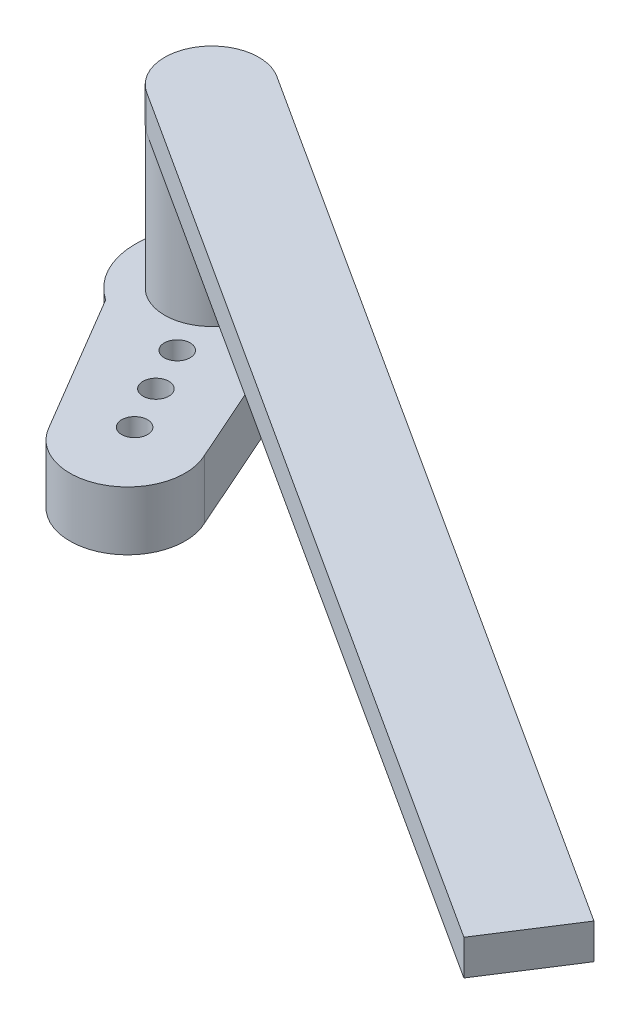
ISO-10303-21;
HEADER;
FILE_DESCRIPTION(('STEP AP214'),'2;1');
FILE_NAME('part.step','',(''),(''),'','','');
FILE_SCHEMA(('AUTOMOTIVE_DESIGN { 1 0 10303 214 1 1 1 1 }'));
ENDSEC;
DATA;
#1=APPLICATION_CONTEXT('core data for automotive mechanical design processes');
#2=APPLICATION_PROTOCOL_DEFINITION('international standard','automotive_design',2000,#1);
#3=PRODUCT_CONTEXT('',#1,'mechanical');
#4=PRODUCT('Part','Part','',(#3));
#5=PRODUCT_RELATED_PRODUCT_CATEGORY('part','',(#4));
#6=PRODUCT_DEFINITION_FORMATION('','',#4);
#7=PRODUCT_DEFINITION_CONTEXT('part definition',#1,'design');
#8=PRODUCT_DEFINITION('design','',#6,#7);
#9=PRODUCT_DEFINITION_SHAPE('','',#8);
#10=(LENGTH_UNIT() NAMED_UNIT(*) SI_UNIT(.MILLI.,.METRE.));
#11=(NAMED_UNIT(*) PLANE_ANGLE_UNIT() SI_UNIT($,.RADIAN.));
#12=(NAMED_UNIT(*) SI_UNIT($,.STERADIAN.) SOLID_ANGLE_UNIT());
#13=UNCERTAINTY_MEASURE_WITH_UNIT(LENGTH_MEASURE(1.E-05),#10,'distance_accuracy_value','');
#14=(GEOMETRIC_REPRESENTATION_CONTEXT(3) GLOBAL_UNCERTAINTY_ASSIGNED_CONTEXT((#13)) GLOBAL_UNIT_ASSIGNED_CONTEXT((#10,
#11,#12)) REPRESENTATION_CONTEXT('',''));
#15=CARTESIAN_POINT('',(0.,0.,0.));
#16=DIRECTION('',(0.,0.,1.));
#17=DIRECTION('',(1.,0.,0.));
#18=AXIS2_PLACEMENT_3D('',#15,#16,#17);
#19=CARTESIAN_POINT('',(-125.332571220291,17.1569540318954,55.4392405632121));
#20=DIRECTION('',(-0.914525403335498,0.,0.404528474466316));
#21=DIRECTION('',(0.404528474466316,0.,0.914525403335498));
#22=AXIS2_PLACEMENT_3D('',#19,#20,#21);
#23=PLANE('',#22);
#24=DIRECTION('',(0.,-1.,0.));
#25=VECTOR('',#24,1.);
#26=CARTESIAN_POINT('',(-47.2251953152146,17.1569540318953,232.018106976274));
#27=LINE('',#26,#25);
#28=CARTESIAN_POINT('',(-47.2251953152146,17.1569540318953,232.018106976274));
#29=VERTEX_POINT('',#28);
#30=CARTESIAN_POINT('',(-47.2251953152146,12.1569540318953,232.018106976274));
#31=VERTEX_POINT('',#30);
#32=EDGE_CURVE('E242',#29,#31,#27,.T.);
#33=ORIENTED_EDGE('',*,*,#32,.T.);
#34=DIRECTION('',(0.404528474466315,0.,0.914525403335498));
#35=VECTOR('',#34,1.);
#36=CARTESIAN_POINT('',(-52.7290342603221,12.1569540318953,219.575471046113));
#37=LINE('',#36,#35);
#38=CARTESIAN_POINT('',(-52.7290342603221,12.1569540318953,219.575471046113));
#39=VERTEX_POINT('',#38);
#40=EDGE_CURVE('E213',#39,#31,#37,.T.);
#41=ORIENTED_EDGE('',*,*,#40,.F.);
#42=DIRECTION('',(0.,-1.,0.));
#43=VECTOR('',#42,1.);
#44=CARTESIAN_POINT('',(-52.7290342603221,17.1569540318953,219.575471046113));
#45=LINE('',#44,#43);
#46=CARTESIAN_POINT('',(-52.7290342603221,17.1569540318953,219.575471046113));
#47=VERTEX_POINT('',#46);
#48=EDGE_CURVE('E12',#47,#39,#45,.T.);
#49=ORIENTED_EDGE('',*,*,#48,.F.);
#50=DIRECTION('',(-0.404528474466316,0.,-0.914525403335498));
#51=VECTOR('',#50,1.);
#52=CARTESIAN_POINT('',(-125.332571220291,17.1569540318954,55.4392405632121));
#53=LINE('',#52,#51);
#54=EDGE_CURVE('E223',#29,#47,#53,.T.);
#55=ORIENTED_EDGE('',*,*,#54,.F.);
#56=EDGE_LOOP('',(#33,#41,#49,#55));
#57=FACE_BOUND('',#56,.T.);
#58=ADVANCED_FACE('F54',(#57),#23,.F.);
#59=CARTESIAN_POINT('',(-59.2267432720247,17.1569540318953,219.402909175357));
#60=DIRECTION('',(0.,-1.,0.));
#61=DIRECTION('',(0.,0.,-1.));
#62=AXIS2_PLACEMENT_3D('',#59,#60,#61);
#63=CYLINDRICAL_SURFACE('',#62,6.5);
#64=ORIENTED_EDGE('',*,*,#48,.T.);
#65=CARTESIAN_POINT('',(-59.2267432720247,12.1569540318953,219.402909175357));
#66=DIRECTION('',(0.,-1.,0.));
#67=DIRECTION('',(0.,0.,-1.));
#68=AXIS2_PLACEMENT_3D('',#65,#66,#67);
#69=CIRCLE('',#68,6.50000000000002);
#70=CARTESIAN_POINT('',(-62.8629678024925,12.1569540318953,224.790661133644));
#71=VERTEX_POINT('',#70);
#72=EDGE_CURVE('E210',#71,#39,#69,.T.);
#73=ORIENTED_EDGE('',*,*,#72,.F.);
#74=DIRECTION('',(0.,-1.,0.));
#75=VECTOR('',#74,1.);
#76=CARTESIAN_POINT('',(-62.8629678024925,17.1569540318953,224.790661133644));
#77=LINE('',#76,#75);
#78=CARTESIAN_POINT('',(-62.8629678024925,17.1569540318953,224.790661133644));
#79=VERTEX_POINT('',#78);
#80=EDGE_CURVE('E61',#79,#71,#77,.T.);
#81=ORIENTED_EDGE('',*,*,#80,.F.);
#82=CARTESIAN_POINT('',(-59.2267432720247,17.1569540318953,219.402909175357));
#83=DIRECTION('',(0.,1.,0.));
#84=DIRECTION('',(0.,0.,1.));
#85=AXIS2_PLACEMENT_3D('',#82,#83,#84);
#86=CIRCLE('',#85,6.5);
#87=EDGE_CURVE('E226',#47,#79,#86,.T.);
#88=ORIENTED_EDGE('',*,*,#87,.F.);
#89=EDGE_LOOP('',(#64,#73,#81,#88));
#90=FACE_BOUND('',#89,.T.);
#91=ADVANCED_FACE('F267',(#90),#63,.T.);
#92=CARTESIAN_POINT('',(-145.067901103589,17.1569540318954,85.7980901296145));
#93=DIRECTION('',(0.860728579626344,0.,-0.509064153338669));
#94=DIRECTION('',(-0.509064153338669,0.,-0.860728579626344));
#95=AXIS2_PLACEMENT_3D('',#92,#93,#94);
#96=PLANE('',#95);
#97=ORIENTED_EDGE('',*,*,#80,.T.);
#98=DIRECTION('',(-0.509064153338669,0.,-0.860728579626344));
#99=VECTOR('',#98,1.);
#100=CARTESIAN_POINT('',(-55.9368617566929,12.1569540318952,236.501360816668));
#101=LINE('',#100,#99);
#102=CARTESIAN_POINT('',(-55.9368617566929,12.1569540318952,236.501360816668));
#103=VERTEX_POINT('',#102);
#104=EDGE_CURVE('E219',#103,#71,#101,.T.);
#105=ORIENTED_EDGE('',*,*,#104,.F.);
#106=DIRECTION('',(0.,-1.,0.));
#107=VECTOR('',#106,1.);
#108=CARTESIAN_POINT('',(-55.9368617566929,17.1569540318952,236.501360816668));
#109=LINE('',#108,#107);
#110=CARTESIAN_POINT('',(-55.9368617566929,17.1569540318952,236.501360816668));
#111=VERTEX_POINT('',#110);
#112=EDGE_CURVE('E254',#111,#103,#109,.T.);
#113=ORIENTED_EDGE('',*,*,#112,.F.);
#114=DIRECTION('',(0.509064153338669,0.,0.860728579626344));
#115=VECTOR('',#114,1.);
#116=CARTESIAN_POINT('',(-145.067901103589,17.1569540318954,85.7980901296145));
#117=LINE('',#116,#115);
#118=EDGE_CURVE('E229',#79,#111,#117,.T.);
#119=ORIENTED_EDGE('',*,*,#118,.F.);
#120=EDGE_LOOP('',(#97,#105,#113,#119));
#121=FACE_BOUND('',#120,.T.);
#122=ADVANCED_FACE('F259',(#121),#96,.F.);
#123=CARTESIAN_POINT('',(-56.1151477013877,17.1569540318953,225.44922813856));
#124=DIRECTION('',(0.,-1.,0.));
#125=DIRECTION('',(0.,0.,-1.));
#126=AXIS2_PLACEMENT_3D('',#123,#124,#125);
#127=CYLINDRICAL_SURFACE('',#126,1.1);
#128=CARTESIAN_POINT('',(-56.1151477013877,17.1569540318953,225.44922813856));
#129=DIRECTION('',(0.,1.,0.));
#130=DIRECTION('',(0.,0.,1.));
#131=AXIS2_PLACEMENT_3D('',#128,#129,#130);
#132=CIRCLE('',#131,1.1);
#133=CARTESIAN_POINT('',(-56.1151477013877,17.1569540318953,226.54922813856));
#134=VERTEX_POINT('',#133);
#135=EDGE_CURVE('E239',#134,#134,#132,.T.);
#136=ORIENTED_EDGE('',*,*,#135,.T.);
#137=EDGE_LOOP('',(#136));
#138=FACE_BOUND('',#137,.T.);
#139=CARTESIAN_POINT('',(-56.1151477013877,14.1569540318953,225.44922813856));
#140=DIRECTION('',(0.,1.,0.));
#141=DIRECTION('',(0.,0.,1.));
#142=AXIS2_PLACEMENT_3D('',#139,#140,#141);
#143=CIRCLE('',#142,1.1);
#144=CARTESIAN_POINT('',(-56.1151477013877,14.1569540318953,226.54922813856));
#145=VERTEX_POINT('',#144);
#146=EDGE_CURVE('E248',#145,#145,#143,.T.);
#147=ORIENTED_EDGE('',*,*,#146,.F.);
#148=EDGE_LOOP('',(#147));
#149=FACE_BOUND('',#148,.T.);
#150=ADVANCED_FACE('F290',(#138,#149),#127,.F.);
#151=CARTESIAN_POINT('',(-54.1932798489355,17.1569540318953,229.183719262891));
#152=DIRECTION('',(0.,-1.,0.));
#153=DIRECTION('',(0.,0.,-1.));
#154=AXIS2_PLACEMENT_3D('',#151,#152,#153);
#155=CYLINDRICAL_SURFACE('',#154,1.1);
#156=CARTESIAN_POINT('',(-54.1932798489355,17.1569540318953,229.183719262891));
#157=DIRECTION('',(0.,1.,0.));
#158=DIRECTION('',(0.,0.,1.));
#159=AXIS2_PLACEMENT_3D('',#156,#157,#158);
#160=CIRCLE('',#159,1.1);
#161=CARTESIAN_POINT('',(-54.1932798489355,17.1569540318953,230.283719262891));
#162=VERTEX_POINT('',#161);
#163=EDGE_CURVE('E236',#162,#162,#160,.T.);
#164=ORIENTED_EDGE('',*,*,#163,.T.);
#165=EDGE_LOOP('',(#164));
#166=FACE_BOUND('',#165,.T.);
#167=CARTESIAN_POINT('',(-54.1932798489355,14.1569540318953,229.183719262891));
#168=DIRECTION('',(0.,1.,0.));
#169=DIRECTION('',(0.,0.,1.));
#170=AXIS2_PLACEMENT_3D('',#167,#168,#169);
#171=CIRCLE('',#170,1.1);
#172=CARTESIAN_POINT('',(-54.1932798489355,14.1569540318953,230.283719262891));
#173=VERTEX_POINT('',#172);
#174=EDGE_CURVE('E245',#173,#173,#171,.T.);
#175=ORIENTED_EDGE('',*,*,#174,.F.);
#176=EDGE_LOOP('',(#175));
#177=FACE_BOUND('',#176,.T.);
#178=ADVANCED_FACE('F293',(#166,#177),#155,.F.);
#179=CARTESIAN_POINT('',(-52.2714119964832,17.1569540318953,232.918210387223));
#180=DIRECTION('',(0.,-1.,0.));
#181=DIRECTION('',(0.,0.,-1.));
#182=AXIS2_PLACEMENT_3D('',#179,#180,#181);
#183=CYLINDRICAL_SURFACE('',#182,1.1);
#184=CARTESIAN_POINT('',(-52.2714119964832,17.1569540318953,232.918210387223));
#185=DIRECTION('',(0.,1.,0.));
#186=DIRECTION('',(0.,0.,1.));
#187=AXIS2_PLACEMENT_3D('',#184,#185,#186);
#188=CIRCLE('',#187,1.1);
#189=CARTESIAN_POINT('',(-52.2714119964832,17.1569540318953,234.018210387223));
#190=VERTEX_POINT('',#189);
#191=EDGE_CURVE('E233',#190,#190,#188,.T.);
#192=ORIENTED_EDGE('',*,*,#191,.T.);
#193=EDGE_LOOP('',(#192));
#194=FACE_BOUND('',#193,.T.);
#195=CARTESIAN_POINT('',(-52.2714119964832,14.1569540318953,232.918210387223));
#196=DIRECTION('',(0.,1.,0.));
#197=DIRECTION('',(0.,0.,1.));
#198=AXIS2_PLACEMENT_3D('',#195,#196,#197);
#199=CIRCLE('',#198,1.1);
#200=CARTESIAN_POINT('',(-52.2714119964832,14.1569540318952,234.018210387223));
#201=VERTEX_POINT('',#200);
#202=EDGE_CURVE('E222',#201,#201,#199,.T.);
#203=ORIENTED_EDGE('',*,*,#202,.F.);
#204=EDGE_LOOP('',(#203));
#205=FACE_BOUND('',#204,.T.);
#206=ADVANCED_FACE('F309',(#194,#205),#183,.F.);
#207=CARTESIAN_POINT('',(-51.6307893789992,17.1569540318952,234.163040762));
#208=DIRECTION('',(0.,-1.,0.));
#209=DIRECTION('',(0.,0.,-1.));
#210=AXIS2_PLACEMENT_3D('',#207,#208,#209);
#211=CYLINDRICAL_SURFACE('',#210,4.90000000000015);
#212=ORIENTED_EDGE('',*,*,#112,.T.);
#213=CARTESIAN_POINT('',(-51.6307893789992,12.1569540318952,234.163040762));
#214=DIRECTION('',(0.,-1.,0.));
#215=DIRECTION('',(0.,0.,-1.));
#216=AXIS2_PLACEMENT_3D('',#213,#214,#215);
#217=CIRCLE('',#216,4.90000000000016);
#218=EDGE_CURVE('E216',#31,#103,#217,.T.);
#219=ORIENTED_EDGE('',*,*,#218,.F.);
#220=ORIENTED_EDGE('',*,*,#32,.F.);
#221=CARTESIAN_POINT('',(-51.6307893789992,17.1569540318952,234.163040762));
#222=DIRECTION('',(0.,1.,0.));
#223=DIRECTION('',(0.,0.,1.));
#224=AXIS2_PLACEMENT_3D('',#221,#222,#223);
#225=CIRCLE('',#224,4.90000000000015);
#226=EDGE_CURVE('E231',#111,#29,#225,.T.);
#227=ORIENTED_EDGE('',*,*,#226,.F.);
#228=EDGE_LOOP('',(#212,#219,#220,#227));
#229=FACE_BOUND('',#228,.T.);
#230=ADVANCED_FACE('F274',(#229),#211,.T.);
#231=CARTESIAN_POINT('',(-59.2267432720247,17.1569540318953,219.402909175357));
#232=DIRECTION('',(0.,-1.,0.));
#233=DIRECTION('',(0.,0.,-1.));
#234=AXIS2_PLACEMENT_3D('',#231,#232,#233);
#235=CYLINDRICAL_SURFACE('',#234,1.74999999999999);
#236=CARTESIAN_POINT('',(-59.2267432720247,17.1569540318953,219.402909175357));
#237=DIRECTION('',(0.,1.,0.));
#238=DIRECTION('',(0.,0.,1.));
#239=AXIS2_PLACEMENT_3D('',#236,#237,#238);
#240=CIRCLE('',#239,1.74999999999999);
#241=CARTESIAN_POINT('',(-59.2267432720247,17.1569540318953,221.152909175357));
#242=VERTEX_POINT('',#241);
#243=EDGE_CURVE('E176',#242,#242,#240,.T.);
#244=ORIENTED_EDGE('',*,*,#243,.T.);
#245=EDGE_LOOP('',(#244));
#246=FACE_BOUND('',#245,.T.);
#247=CARTESIAN_POINT('',(-59.2267432720247,14.1569540318953,219.402909175357));
#248=DIRECTION('',(0.,1.,0.));
#249=DIRECTION('',(0.,0.,1.));
#250=AXIS2_PLACEMENT_3D('',#247,#248,#249);
#251=CIRCLE('',#250,1.74999999999999);
#252=CARTESIAN_POINT('',(-59.2267432720247,14.1569540318953,221.152909175357));
#253=VERTEX_POINT('',#252);
#254=EDGE_CURVE('E227',#253,#253,#251,.T.);
#255=ORIENTED_EDGE('',*,*,#254,.F.);
#256=EDGE_LOOP('',(#255));
#257=FACE_BOUND('',#256,.T.);
#258=ADVANCED_FACE('F281',(#246,#257),#235,.F.);
#259=CARTESIAN_POINT('',(0.,17.1569540318955,0.));
#260=DIRECTION('',(0.,1.,0.));
#261=DIRECTION('',(0.,0.,1.));
#262=AXIS2_PLACEMENT_3D('',#259,#260,#261);
#263=PLANE('',#262);
#264=CARTESIAN_POINT('',(-59.2267432720247,17.1569540318953,219.402909175357));
#265=DIRECTION('',(0.,1.,0.));
#266=DIRECTION('',(0.,0.,1.));
#267=AXIS2_PLACEMENT_3D('',#264,#265,#266);
#268=CIRCLE('',#267,4.);
#269=CARTESIAN_POINT('',(-59.2267432720247,17.1569540318953,223.402909175357));
#270=VERTEX_POINT('',#269);
#271=EDGE_CURVE('E174',#270,#270,#268,.T.);
#272=ORIENTED_EDGE('',*,*,#271,.F.);
#273=EDGE_LOOP('',(#272));
#274=FACE_BOUND('',#273,.T.);
#275=ORIENTED_EDGE('',*,*,#54,.T.);
#276=ORIENTED_EDGE('',*,*,#87,.T.);
#277=ORIENTED_EDGE('',*,*,#118,.T.);
#278=ORIENTED_EDGE('',*,*,#226,.T.);
#279=EDGE_LOOP('',(#275,#276,#277,#278));
#280=FACE_BOUND('',#279,.T.);
#281=ORIENTED_EDGE('',*,*,#191,.F.);
#282=EDGE_LOOP('',(#281));
#283=FACE_BOUND('',#282,.T.);
#284=ORIENTED_EDGE('',*,*,#163,.F.);
#285=EDGE_LOOP('',(#284));
#286=FACE_BOUND('',#285,.T.);
#287=ORIENTED_EDGE('',*,*,#135,.F.);
#288=EDGE_LOOP('',(#287));
#289=FACE_BOUND('',#288,.T.);
#290=ADVANCED_FACE('F277',(#274,#280,#283,#286,#289),#263,.T.);
#291=CARTESIAN_POINT('',(0.,14.1569540318955,0.));
#292=DIRECTION('',(0.,1.,0.));
#293=DIRECTION('',(0.,0.,1.));
#294=AXIS2_PLACEMENT_3D('',#291,#292,#293);
#295=PLANE('',#294);
#296=DIRECTION('',(-0.50906415333867,0.,-0.860728579626344));
#297=VECTOR('',#296,1.);
#298=CARTESIAN_POINT('',(-54.1943274219936,14.1569540318952,235.518869918687));
#299=LINE('',#298,#297);
#300=CARTESIAN_POINT('',(-54.1943274219936,14.1569540318952,235.518869918687));
#301=VERTEX_POINT('',#300);
#302=CARTESIAN_POINT('',(-61.3931100666563,14.1569540318953,223.347127084032));
#303=VERTEX_POINT('',#302);
#304=EDGE_CURVE('E185',#301,#303,#299,.T.);
#305=ORIENTED_EDGE('',*,*,#304,.T.);
#306=CARTESIAN_POINT('',(-59.2267432720247,14.1569540318953,219.402909175357));
#307=DIRECTION('',(0.,-1.,0.));
#308=DIRECTION('',(0.,0.,-1.));
#309=AXIS2_PLACEMENT_3D('',#306,#307,#308);
#310=CIRCLE('',#309,4.50000000000001);
#311=CARTESIAN_POINT('',(-54.758018867603,14.1569540318953,219.932533756854));
#312=VERTEX_POINT('',#311);
#313=EDGE_CURVE('E181',#303,#312,#310,.T.);
#314=ORIENTED_EDGE('',*,*,#313,.T.);
#315=DIRECTION('',(0.404528474466316,0.,0.914525403335498));
#316=VECTOR('',#315,1.);
#317=CARTESIAN_POINT('',(-54.758018867603,14.1569540318953,219.932533756854));
#318=LINE('',#317,#316);
#319=CARTESIAN_POINT('',(-49.0374971177129,14.1569540318953,232.865028725248));
#320=VERTEX_POINT('',#319);
#321=EDGE_CURVE('E194',#312,#320,#318,.T.);
#322=ORIENTED_EDGE('',*,*,#321,.T.);
#323=CARTESIAN_POINT('',(-51.6307893789992,14.1569540318952,234.163040762));
#324=DIRECTION('',(0.,-1.,0.));
#325=DIRECTION('',(0.,0.,-1.));
#326=AXIS2_PLACEMENT_3D('',#323,#324,#325);
#327=CIRCLE('',#326,2.90000000000016);
#328=EDGE_CURVE('E197',#320,#301,#327,.T.);
#329=ORIENTED_EDGE('',*,*,#328,.T.);
#330=EDGE_LOOP('',(#305,#314,#322,#329));
#331=FACE_BOUND('',#330,.T.);
#332=ORIENTED_EDGE('',*,*,#202,.T.);
#333=EDGE_LOOP('',(#332));
#334=FACE_BOUND('',#333,.T.);
#335=ORIENTED_EDGE('',*,*,#174,.T.);
#336=EDGE_LOOP('',(#335));
#337=FACE_BOUND('',#336,.T.);
#338=ORIENTED_EDGE('',*,*,#146,.T.);
#339=EDGE_LOOP('',(#338));
#340=FACE_BOUND('',#339,.T.);
#341=ORIENTED_EDGE('',*,*,#254,.T.);
#342=EDGE_LOOP('',(#341));
#343=FACE_BOUND('',#342,.T.);
#344=ADVANCED_FACE('F280',(#331,#334,#337,#340,#343),#295,.F.);
#345=CARTESIAN_POINT('',(-59.2267432720247,12.1569540318953,219.402909175357));
#346=DIRECTION('',(0.,-1.,0.));
#347=DIRECTION('',(0.,0.,-1.));
#348=AXIS2_PLACEMENT_3D('',#345,#346,#347);
#349=PLANE('',#348);
#350=ORIENTED_EDGE('',*,*,#72,.T.);
#351=ORIENTED_EDGE('',*,*,#40,.T.);
#352=ORIENTED_EDGE('',*,*,#218,.T.);
#353=ORIENTED_EDGE('',*,*,#104,.T.);
#354=EDGE_LOOP('',(#350,#351,#352,#353));
#355=FACE_BOUND('',#354,.T.);
#356=DIRECTION('',(0.404528474466316,0.,0.914525403335498));
#357=VECTOR('',#356,1.);
#358=CARTESIAN_POINT('',(-54.758018867603,12.1569540318953,219.932533756854));
#359=LINE('',#358,#357);
#360=CARTESIAN_POINT('',(-54.758018867603,12.1569540318953,219.932533756854));
#361=VERTEX_POINT('',#360);
#362=CARTESIAN_POINT('',(-49.0374971177129,12.1569540318953,232.865028725248));
#363=VERTEX_POINT('',#362);
#364=EDGE_CURVE('E184',#361,#363,#359,.T.);
#365=ORIENTED_EDGE('',*,*,#364,.F.);
#366=CARTESIAN_POINT('',(-59.2267432720247,12.1569540318953,219.402909175357));
#367=DIRECTION('',(0.,-1.,0.));
#368=DIRECTION('',(0.,0.,-1.));
#369=AXIS2_PLACEMENT_3D('',#366,#367,#368);
#370=CIRCLE('',#369,4.50000000000001);
#371=CARTESIAN_POINT('',(-61.3931100666563,12.1569540318953,223.347127084032));
#372=VERTEX_POINT('',#371);
#373=EDGE_CURVE('E182',#372,#361,#370,.T.);
#374=ORIENTED_EDGE('',*,*,#373,.F.);
#375=DIRECTION('',(-0.50906415333867,0.,-0.860728579626344));
#376=VECTOR('',#375,1.);
#377=CARTESIAN_POINT('',(-54.1943274219936,12.1569540318952,235.518869918687));
#378=LINE('',#377,#376);
#379=CARTESIAN_POINT('',(-54.1943274219936,12.1569540318952,235.518869918687));
#380=VERTEX_POINT('',#379);
#381=EDGE_CURVE('E190',#380,#372,#378,.T.);
#382=ORIENTED_EDGE('',*,*,#381,.F.);
#383=CARTESIAN_POINT('',(-51.6307893789992,12.1569540318952,234.163040762));
#384=DIRECTION('',(0.,-1.,0.));
#385=DIRECTION('',(0.,0.,-1.));
#386=AXIS2_PLACEMENT_3D('',#383,#384,#385);
#387=CIRCLE('',#386,2.90000000000016);
#388=EDGE_CURVE('E187',#363,#380,#387,.T.);
#389=ORIENTED_EDGE('',*,*,#388,.F.);
#390=EDGE_LOOP('',(#365,#374,#382,#389));
#391=FACE_BOUND('',#390,.T.);
#392=ADVANCED_FACE('F264',(#355,#391),#349,.T.);
#393=CARTESIAN_POINT('',(-59.2267432720247,12.1569540318953,219.402909175357));
#394=DIRECTION('',(0.,1.,0.));
#395=DIRECTION('',(0.,0.,1.));
#396=AXIS2_PLACEMENT_3D('',#393,#394,#395);
#397=CYLINDRICAL_SURFACE('',#396,4.50000000000001);
#398=ORIENTED_EDGE('',*,*,#313,.F.);
#399=DIRECTION('',(0.,1.,0.));
#400=VECTOR('',#399,1.);
#401=CARTESIAN_POINT('',(-61.3931100666563,12.1569540318953,223.347127084032));
#402=LINE('',#401,#400);
#403=EDGE_CURVE('E76',#372,#303,#402,.T.);
#404=ORIENTED_EDGE('',*,*,#403,.F.);
#405=ORIENTED_EDGE('',*,*,#373,.T.);
#406=DIRECTION('',(0.,1.,0.));
#407=VECTOR('',#406,1.);
#408=CARTESIAN_POINT('',(-54.758018867603,12.1569540318953,219.932533756854));
#409=LINE('',#408,#407);
#410=EDGE_CURVE('E207',#361,#312,#409,.T.);
#411=ORIENTED_EDGE('',*,*,#410,.T.);
#412=EDGE_LOOP('',(#398,#404,#405,#411));
#413=FACE_BOUND('',#412,.T.);
#414=ADVANCED_FACE('F361',(#413),#397,.F.);
#415=CARTESIAN_POINT('',(-54.758018867603,12.1569540318953,219.932533756854));
#416=DIRECTION('',(-0.914525403335498,0.,0.404528474466316));
#417=DIRECTION('',(0.404528474466316,0.,0.914525403335498));
#418=AXIS2_PLACEMENT_3D('',#415,#416,#417);
#419=PLANE('',#418);
#420=ORIENTED_EDGE('',*,*,#321,.F.);
#421=ORIENTED_EDGE('',*,*,#410,.F.);
#422=ORIENTED_EDGE('',*,*,#364,.T.);
#423=DIRECTION('',(0.,1.,0.));
#424=VECTOR('',#423,1.);
#425=CARTESIAN_POINT('',(-49.0374971177129,12.1569540318953,232.865028725248));
#426=LINE('',#425,#424);
#427=EDGE_CURVE('E205',#363,#320,#426,.T.);
#428=ORIENTED_EDGE('',*,*,#427,.T.);
#429=EDGE_LOOP('',(#420,#421,#422,#428));
#430=FACE_BOUND('',#429,.T.);
#431=ADVANCED_FACE('F370',(#430),#419,.T.);
#432=CARTESIAN_POINT('',(-51.6307893789992,12.1569540318952,234.163040762));
#433=DIRECTION('',(0.,1.,0.));
#434=DIRECTION('',(0.,0.,1.));
#435=AXIS2_PLACEMENT_3D('',#432,#433,#434);
#436=CYLINDRICAL_SURFACE('',#435,2.90000000000016);
#437=ORIENTED_EDGE('',*,*,#328,.F.);
#438=ORIENTED_EDGE('',*,*,#427,.F.);
#439=ORIENTED_EDGE('',*,*,#388,.T.);
#440=DIRECTION('',(0.,1.,0.));
#441=VECTOR('',#440,1.);
#442=CARTESIAN_POINT('',(-54.1943274219936,12.1569540318952,235.518869918687));
#443=LINE('',#442,#441);
#444=EDGE_CURVE('E203',#380,#301,#443,.T.);
#445=ORIENTED_EDGE('',*,*,#444,.T.);
#446=EDGE_LOOP('',(#437,#438,#439,#445));
#447=FACE_BOUND('',#446,.T.);
#448=ADVANCED_FACE('F380',(#447),#436,.F.);
#449=CARTESIAN_POINT('',(-54.1943274219936,12.1569540318952,235.518869918687));
#450=DIRECTION('',(0.860728579626344,0.,-0.50906415333867));
#451=DIRECTION('',(-0.50906415333867,0.,-0.860728579626344));
#452=AXIS2_PLACEMENT_3D('',#449,#450,#451);
#453=PLANE('',#452);
#454=ORIENTED_EDGE('',*,*,#304,.F.);
#455=ORIENTED_EDGE('',*,*,#444,.F.);
#456=ORIENTED_EDGE('',*,*,#381,.T.);
#457=ORIENTED_EDGE('',*,*,#403,.T.);
#458=EDGE_LOOP('',(#454,#455,#456,#457));
#459=FACE_BOUND('',#458,.T.);
#460=ADVANCED_FACE('F390',(#459),#453,.T.);
#461=CARTESIAN_POINT('',(-59.2267432720247,17.1569540318953,219.402909175357));
#462=DIRECTION('',(0.,1.,0.));
#463=DIRECTION('',(0.,0.,1.));
#464=AXIS2_PLACEMENT_3D('',#461,#462,#463);
#465=PLANE('',#464);
#466=CARTESIAN_POINT('',(-59.2267432720247,17.1569540318953,219.402909175357));
#467=DIRECTION('',(0.,1.,0.));
#468=DIRECTION('',(0.,0.,1.));
#469=AXIS2_PLACEMENT_3D('',#466,#467,#468);
#470=CIRCLE('',#469,1.5);
#471=CARTESIAN_POINT('',(-59.2267432720247,17.1569540318953,220.902909175357));
#472=VERTEX_POINT('',#471);
#473=EDGE_CURVE('E166',#472,#472,#470,.T.);
#474=ORIENTED_EDGE('',*,*,#473,.T.);
#475=EDGE_LOOP('',(#474));
#476=FACE_BOUND('',#475,.T.);
#477=ORIENTED_EDGE('',*,*,#243,.F.);
#478=EDGE_LOOP('',(#477));
#479=FACE_BOUND('',#478,.T.);
#480=ADVANCED_FACE('F400',(#476,#479),#465,.F.);
#481=CARTESIAN_POINT('',(-59.2267432720247,29.1569540318953,219.402909175357));
#482=DIRECTION('',(0.,-1.,0.));
#483=DIRECTION('',(0.,0.,-1.));
#484=AXIS2_PLACEMENT_3D('',#481,#482,#483);
#485=CYLINDRICAL_SURFACE('',#484,4.);
#486=CARTESIAN_POINT('',(-59.2267432720247,29.1569540318953,219.402909175357));
#487=DIRECTION('',(0.,1.,0.));
#488=DIRECTION('',(0.,0.,1.));
#489=AXIS2_PLACEMENT_3D('',#486,#487,#488);
#490=CIRCLE('',#489,4.);
#491=CARTESIAN_POINT('',(-61.3917244697946,29.1569540318953,222.766368170692));
#492=VERTEX_POINT('',#491);
#493=CARTESIAN_POINT('',(-57.0617620742549,29.1569540318953,216.039450180021));
#494=VERTEX_POINT('',#493);
#495=EDGE_CURVE('E68',#492,#494,#490,.T.);
#496=ORIENTED_EDGE('',*,*,#495,.F.);
#497=DIRECTION('',(0.,-1.,0.));
#498=VECTOR('',#497,1.);
#499=CARTESIAN_POINT('',(-61.3917244697945,32.1569540318953,222.766368170692));
#500=LINE('',#499,#498);
#501=CARTESIAN_POINT('',(-61.3917244697945,32.1569540318953,222.766368170692));
#502=VERTEX_POINT('',#501);
#503=EDGE_CURVE('E146',#502,#492,#500,.T.);
#504=ORIENTED_EDGE('',*,*,#503,.F.);
#505=CARTESIAN_POINT('',(-59.2267432720247,32.1569540318953,219.402909175357));
#506=DIRECTION('',(0.,1.,0.));
#507=DIRECTION('',(0.,0.,1.));
#508=AXIS2_PLACEMENT_3D('',#505,#506,#507);
#509=CIRCLE('',#508,4.00000000000002);
#510=CARTESIAN_POINT('',(-57.0617620742549,32.1569540318953,216.039450180021));
#511=VERTEX_POINT('',#510);
#512=EDGE_CURVE('E152',#511,#502,#509,.T.);
#513=ORIENTED_EDGE('',*,*,#512,.F.);
#514=DIRECTION('',(0.,-1.,0.));
#515=VECTOR('',#514,1.);
#516=CARTESIAN_POINT('',(-57.0617620742549,32.1569540318953,216.039450180021));
#517=LINE('',#516,#515);
#518=EDGE_CURVE('E498',#511,#494,#517,.T.);
#519=ORIENTED_EDGE('',*,*,#518,.T.);
#520=EDGE_LOOP('',(#496,#504,#513,#519));
#521=FACE_BOUND('',#520,.T.);
#522=ORIENTED_EDGE('',*,*,#271,.T.);
#523=EDGE_LOOP('',(#522));
#524=FACE_BOUND('',#523,.T.);
#525=ADVANCED_FACE('F161',(#521,#524),#485,.T.);
#526=CARTESIAN_POINT('',(-59.2267432720247,29.1569540318953,219.402909175357));
#527=DIRECTION('',(0.,-1.,0.));
#528=DIRECTION('',(0.,0.,-1.));
#529=AXIS2_PLACEMENT_3D('',#526,#527,#528);
#530=CYLINDRICAL_SURFACE('',#529,1.5);
#531=CARTESIAN_POINT('',(-59.2267432720247,29.1569540318953,219.402909175357));
#532=DIRECTION('',(0.,1.,0.));
#533=DIRECTION('',(0.,0.,1.));
#534=AXIS2_PLACEMENT_3D('',#531,#532,#533);
#535=CIRCLE('',#534,1.5);
#536=CARTESIAN_POINT('',(-59.2267432720247,29.1569540318953,220.902909175357));
#537=VERTEX_POINT('',#536);
#538=EDGE_CURVE('E163',#537,#537,#535,.T.);
#539=ORIENTED_EDGE('',*,*,#538,.T.);
#540=EDGE_LOOP('',(#539));
#541=FACE_BOUND('',#540,.T.);
#542=ORIENTED_EDGE('',*,*,#473,.F.);
#543=EDGE_LOOP('',(#542));
#544=FACE_BOUND('',#543,.T.);
#545=ADVANCED_FACE('F424',(#541,#544),#530,.F.);
#546=CARTESIAN_POINT('',(-59.2267432720247,29.1569540318953,219.402909175357));
#547=DIRECTION('',(0.,1.,0.));
#548=DIRECTION('',(0.,0.,1.));
#549=AXIS2_PLACEMENT_3D('',#546,#547,#548);
#550=PLANE('',#549);
#551=ORIENTED_EDGE('',*,*,#538,.F.);
#552=EDGE_LOOP('',(#551));
#553=FACE_BOUND('',#552,.T.);
#554=ADVANCED_FACE('F429',(#553),#550,.F.);
#555=DIRECTION('',(0.840864748833872,0.,0.541245299442451));
#556=VECTOR('',#555,1.);
#557=CARTESIAN_POINT('',(-61.3917244697945,29.1569540318953,222.766368170692));
#558=LINE('',#557,#556);
#559=CARTESIAN_POINT('',(14.286102925254,29.1569540318952,271.478445120513));
#560=VERTEX_POINT('',#559);
#561=EDGE_CURVE('E507',#492,#560,#558,.T.);
#562=ORIENTED_EDGE('',*,*,#561,.F.);
#563=ORIENTED_EDGE('',*,*,#495,.T.);
#564=DIRECTION('',(-0.840864748833872,0.,-0.541245299442452));
#565=VECTOR('',#564,1.);
#566=CARTESIAN_POINT('',(-57.0617620742549,29.1569540318953,216.039450180021));
#567=LINE('',#566,#565);
#568=CARTESIAN_POINT('',(18.6160653207936,29.1569540318952,264.751527129842));
#569=VERTEX_POINT('',#568);
#570=EDGE_CURVE('E159',#569,#494,#567,.T.);
#571=ORIENTED_EDGE('',*,*,#570,.F.);
#572=DIRECTION('',(0.54124529944245,0.,-0.840864748833873));
#573=VECTOR('',#572,1.);
#574=CARTESIAN_POINT('',(18.6160653207936,29.1569540318952,264.751527129842));
#575=LINE('',#574,#573);
#576=EDGE_CURVE('E501',#560,#569,#575,.T.);
#577=ORIENTED_EDGE('',*,*,#576,.F.);
#578=EDGE_LOOP('',(#562,#563,#571,#577));
#579=FACE_BOUND('',#578,.T.);
#580=ADVANCED_FACE('F446',(#579),#550,.F.);
#581=CARTESIAN_POINT('',(-61.3917244697945,32.1569540318953,222.766368170692));
#582=DIRECTION('',(0.541245299442451,0.,-0.840864748833872));
#583=DIRECTION('',(-0.840864748833872,0.,-0.541245299442451));
#584=AXIS2_PLACEMENT_3D('',#581,#582,#583);
#585=PLANE('',#584);
#586=ORIENTED_EDGE('',*,*,#561,.T.);
#587=DIRECTION('',(0.,-1.,0.));
#588=VECTOR('',#587,1.);
#589=CARTESIAN_POINT('',(14.286102925254,32.1569540318952,271.478445120513));
#590=LINE('',#589,#588);
#591=CARTESIAN_POINT('',(14.286102925254,32.1569540318952,271.478445120513));
#592=VERTEX_POINT('',#591);
#593=EDGE_CURVE('E148',#592,#560,#590,.T.);
#594=ORIENTED_EDGE('',*,*,#593,.F.);
#595=DIRECTION('',(0.840864748833872,0.,0.541245299442451));
#596=VECTOR('',#595,1.);
#597=CARTESIAN_POINT('',(-61.3917244697945,32.1569540318953,222.766368170692));
#598=LINE('',#597,#596);
#599=EDGE_CURVE('E143',#502,#592,#598,.T.);
#600=ORIENTED_EDGE('',*,*,#599,.F.);
#601=ORIENTED_EDGE('',*,*,#503,.T.);
#602=EDGE_LOOP('',(#586,#594,#600,#601));
#603=FACE_BOUND('',#602,.T.);
#604=ADVANCED_FACE('F145',(#603),#585,.F.);
#605=CARTESIAN_POINT('',(18.6160653207936,32.1569540318952,264.751527129842));
#606=DIRECTION('',(-0.840864748833873,0.,-0.54124529944245));
#607=DIRECTION('',(-0.54124529944245,0.,0.840864748833874));
#608=AXIS2_PLACEMENT_3D('',#605,#606,#607);
#609=PLANE('',#608);
#610=ORIENTED_EDGE('',*,*,#576,.T.);
#611=DIRECTION('',(0.,-1.,0.));
#612=VECTOR('',#611,1.);
#613=CARTESIAN_POINT('',(18.6160653207936,32.1569540318952,264.751527129842));
#614=LINE('',#613,#612);
#615=CARTESIAN_POINT('',(18.6160653207936,32.1569540318952,264.751527129842));
#616=VERTEX_POINT('',#615);
#617=EDGE_CURVE('E168',#616,#569,#614,.T.);
#618=ORIENTED_EDGE('',*,*,#617,.F.);
#619=DIRECTION('',(0.54124529944245,0.,-0.840864748833873));
#620=VECTOR('',#619,1.);
#621=CARTESIAN_POINT('',(18.6160653207936,32.1569540318952,264.751527129842));
#622=LINE('',#621,#620);
#623=EDGE_CURVE('E151',#592,#616,#622,.T.);
#624=ORIENTED_EDGE('',*,*,#623,.F.);
#625=ORIENTED_EDGE('',*,*,#593,.T.);
#626=EDGE_LOOP('',(#610,#618,#624,#625));
#627=FACE_BOUND('',#626,.T.);
#628=ADVANCED_FACE('F464',(#627),#609,.F.);
#629=CARTESIAN_POINT('',(-57.0617620742549,32.1569540318953,216.039450180021));
#630=DIRECTION('',(-0.541245299442451,0.,0.840864748833872));
#631=DIRECTION('',(0.840864748833872,0.,0.541245299442452));
#632=AXIS2_PLACEMENT_3D('',#629,#630,#631);
#633=PLANE('',#632);
#634=ORIENTED_EDGE('',*,*,#570,.T.);
#635=ORIENTED_EDGE('',*,*,#518,.F.);
#636=DIRECTION('',(-0.840864748833872,0.,-0.541245299442452));
#637=VECTOR('',#636,1.);
#638=CARTESIAN_POINT('',(-57.0617620742549,32.1569540318953,216.039450180021));
#639=LINE('',#638,#637);
#640=EDGE_CURVE('E157',#616,#511,#639,.T.);
#641=ORIENTED_EDGE('',*,*,#640,.F.);
#642=ORIENTED_EDGE('',*,*,#617,.T.);
#643=EDGE_LOOP('',(#634,#635,#641,#642));
#644=FACE_BOUND('',#643,.T.);
#645=ADVANCED_FACE('F473',(#644),#633,.F.);
#646=CARTESIAN_POINT('',(-59.2267432720247,32.1569540318953,219.402909175357));
#647=DIRECTION('',(0.,1.,0.));
#648=DIRECTION('',(0.,0.,1.));
#649=AXIS2_PLACEMENT_3D('',#646,#647,#648);
#650=PLANE('',#649);
#651=ORIENTED_EDGE('',*,*,#512,.T.);
#652=ORIENTED_EDGE('',*,*,#599,.T.);
#653=ORIENTED_EDGE('',*,*,#623,.T.);
#654=ORIENTED_EDGE('',*,*,#640,.T.);
#655=EDGE_LOOP('',(#651,#652,#653,#654));
#656=FACE_BOUND('',#655,.T.);
#657=ADVANCED_FACE('F155',(#656),#650,.T.);
#658=CLOSED_SHELL('',(#58,#91,#122,#150,#178,#206,#230,#258,#290,#344,#392,#414,#431,#448,#460,
#480,#525,#545,#554,#580,#604,#628,#645,#657));
#659=MANIFOLD_SOLID_BREP('B2',#658);
#660=ADVANCED_BREP_SHAPE_REPRESENTATION('',(#18,#659),#14);
#661=SHAPE_DEFINITION_REPRESENTATION(#9,#660);
ENDSEC;
END-ISO-10303-21;
